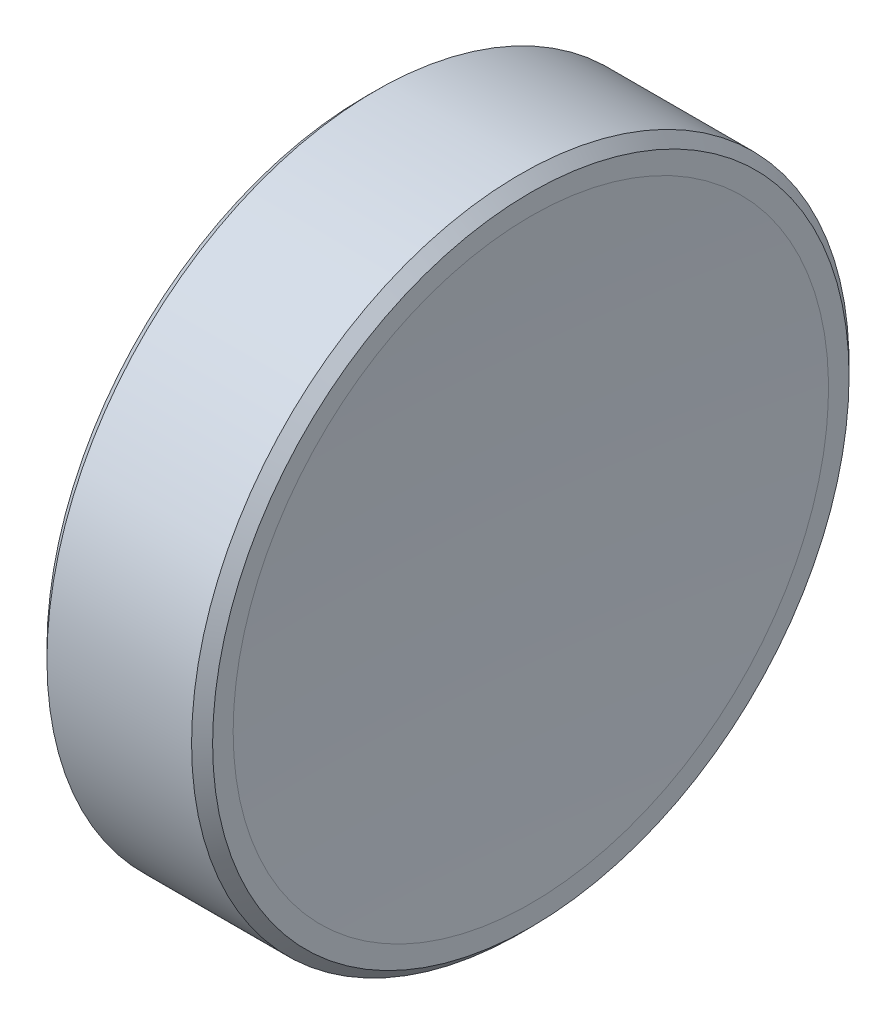
ISO-10303-21;
HEADER;
FILE_DESCRIPTION(('STEP AP214'),'2;1');
FILE_NAME('part.step','',(''),(''),'','','');
FILE_SCHEMA(('AUTOMOTIVE_DESIGN { 1 0 10303 214 1 1 1 1 }'));
ENDSEC;
DATA;
#1=APPLICATION_CONTEXT('core data for automotive mechanical design processes');
#2=APPLICATION_PROTOCOL_DEFINITION('international standard','automotive_design',2000,#1);
#3=PRODUCT_CONTEXT('',#1,'mechanical');
#4=PRODUCT('Part','Part','',(#3));
#5=PRODUCT_RELATED_PRODUCT_CATEGORY('part','',(#4));
#6=PRODUCT_DEFINITION_FORMATION('','',#4);
#7=PRODUCT_DEFINITION_CONTEXT('part definition',#1,'design');
#8=PRODUCT_DEFINITION('design','',#6,#7);
#9=PRODUCT_DEFINITION_SHAPE('','',#8);
#10=(LENGTH_UNIT() NAMED_UNIT(*) SI_UNIT(.MILLI.,.METRE.));
#11=(NAMED_UNIT(*) PLANE_ANGLE_UNIT() SI_UNIT($,.RADIAN.));
#12=(NAMED_UNIT(*) SI_UNIT($,.STERADIAN.) SOLID_ANGLE_UNIT());
#13=UNCERTAINTY_MEASURE_WITH_UNIT(LENGTH_MEASURE(1.E-05),#10,'distance_accuracy_value','');
#14=(GEOMETRIC_REPRESENTATION_CONTEXT(3) GLOBAL_UNCERTAINTY_ASSIGNED_CONTEXT((#13)) GLOBAL_UNIT_ASSIGNED_CONTEXT((#10,
#11,#12)) REPRESENTATION_CONTEXT('',''));
#15=CARTESIAN_POINT('',(0.,0.,0.));
#16=DIRECTION('',(0.,0.,1.));
#17=DIRECTION('',(1.,0.,0.));
#18=AXIS2_PLACEMENT_3D('',#15,#16,#17);
#19=CARTESIAN_POINT('',(267.602310034021,0.,0.));
#20=DIRECTION('',(-1.,0.,0.));
#21=DIRECTION('',(0.,1.,0.));
#22=AXIS2_PLACEMENT_3D('',#19,#20,#21);
#23=SPHERICAL_SURFACE('',#22,260.);
#24=CARTESIAN_POINT('',(8.,0.,0.));
#25=DIRECTION('',(-1.,0.,0.));
#26=DIRECTION('',(0.,0.,1.));
#27=AXIS2_PLACEMENT_3D('',#24,#25,#26);
#28=CIRCLE('',#27,14.375);
#29=CARTESIAN_POINT('',(8.,0.,14.375));
#30=VERTEX_POINT('',#29);
#31=EDGE_CURVE('E36',#30,#30,#28,.T.);
#32=ORIENTED_EDGE('',*,*,#31,.F.);
#33=EDGE_LOOP('',(#32));
#34=FACE_BOUND('',#33,.T.);
#35=ADVANCED_FACE('F15',(#34),#23,.F.);
#36=CARTESIAN_POINT('',(8.,15.875,0.));
#37=DIRECTION('',(-1.,0.,0.));
#38=DIRECTION('',(0.,0.,1.));
#39=AXIS2_PLACEMENT_3D('',#36,#37,#38);
#40=PLANE('',#39);
#41=CARTESIAN_POINT('',(8.,0.,0.));
#42=DIRECTION('',(-1.,0.,0.));
#43=DIRECTION('',(0.,0.,1.));
#44=AXIS2_PLACEMENT_3D('',#41,#42,#43);
#45=CIRCLE('',#44,15.367);
#46=CARTESIAN_POINT('',(8.,0.,15.367));
#47=VERTEX_POINT('',#46);
#48=EDGE_CURVE('E23',#47,#47,#45,.F.);
#49=ORIENTED_EDGE('',*,*,#48,.T.);
#50=EDGE_LOOP('',(#49));
#51=FACE_BOUND('',#50,.T.);
#52=ORIENTED_EDGE('',*,*,#31,.T.);
#53=EDGE_LOOP('',(#52));
#54=FACE_BOUND('',#53,.T.);
#55=ADVANCED_FACE('F40',(#51,#54),#40,.F.);
#56=CARTESIAN_POINT('',(0.,0.,0.));
#57=DIRECTION('',(-1.,0.,0.));
#58=DIRECTION('',(0.,0.,1.));
#59=AXIS2_PLACEMENT_3D('',#56,#57,#58);
#60=CYLINDRICAL_SURFACE('',#59,15.875);
#61=CARTESIAN_POINT('',(7.492,0.,0.));
#62=DIRECTION('',(-1.,0.,0.));
#63=DIRECTION('',(0.,0.,1.));
#64=AXIS2_PLACEMENT_3D('',#61,#62,#63);
#65=CIRCLE('',#64,15.875);
#66=CARTESIAN_POINT('',(7.492,0.,15.875));
#67=VERTEX_POINT('',#66);
#68=EDGE_CURVE('E27',#67,#67,#65,.T.);
#69=ORIENTED_EDGE('',*,*,#68,.T.);
#70=EDGE_LOOP('',(#69));
#71=FACE_BOUND('',#70,.T.);
#72=CARTESIAN_POINT('',(0.508000000000015,0.,0.));
#73=DIRECTION('',(1.,0.,0.));
#74=DIRECTION('',(0.,0.,-1.));
#75=AXIS2_PLACEMENT_3D('',#72,#73,#74);
#76=CIRCLE('',#75,15.875);
#77=CARTESIAN_POINT('',(0.508000000000015,0.,-15.875));
#78=VERTEX_POINT('',#77);
#79=EDGE_CURVE('E31',#78,#78,#76,.T.);
#80=ORIENTED_EDGE('',*,*,#79,.T.);
#81=EDGE_LOOP('',(#80));
#82=FACE_BOUND('',#81,.T.);
#83=ADVANCED_FACE('F49',(#71,#82),#60,.T.);
#84=CARTESIAN_POINT('',(0.,0.,0.));
#85=DIRECTION('',(1.,0.,0.));
#86=DIRECTION('',(0.,0.,-1.));
#87=AXIS2_PLACEMENT_3D('',#84,#85,#86);
#88=PLANE('',#87);
#89=CARTESIAN_POINT('',(0.,0.,0.));
#90=DIRECTION('',(1.,0.,0.));
#91=DIRECTION('',(0.,0.,-1.));
#92=AXIS2_PLACEMENT_3D('',#89,#90,#91);
#93=CIRCLE('',#92,15.367);
#94=CARTESIAN_POINT('',(0.,0.,-15.367));
#95=VERTEX_POINT('',#94);
#96=EDGE_CURVE('E10',#95,#95,#93,.F.);
#97=ORIENTED_EDGE('',*,*,#96,.T.);
#98=EDGE_LOOP('',(#97));
#99=FACE_BOUND('',#98,.T.);
#100=ADVANCED_FACE('F58',(#99),#88,.F.);
#101=CARTESIAN_POINT('',(7.492,0.,0.));
#102=DIRECTION('',(-1.,0.,0.));
#103=DIRECTION('',(0.,0.,1.));
#104=AXIS2_PLACEMENT_3D('',#101,#102,#103);
#105=CONICAL_SURFACE('',#104,15.875,0.785398163397452);
#106=ORIENTED_EDGE('',*,*,#48,.F.);
#107=EDGE_LOOP('',(#106));
#108=FACE_BOUND('',#107,.T.);
#109=ORIENTED_EDGE('',*,*,#68,.F.);
#110=EDGE_LOOP('',(#109));
#111=FACE_BOUND('',#110,.T.);
#112=ADVANCED_FACE('F53',(#108,#111),#105,.T.);
#113=CARTESIAN_POINT('',(0.,0.,0.));
#114=DIRECTION('',(1.,0.,0.));
#115=DIRECTION('',(0.,0.,-1.));
#116=AXIS2_PLACEMENT_3D('',#113,#114,#115);
#117=CONICAL_SURFACE('',#116,15.367,0.785398163397442);
#118=ORIENTED_EDGE('',*,*,#79,.F.);
#119=EDGE_LOOP('',(#118));
#120=FACE_BOUND('',#119,.T.);
#121=ORIENTED_EDGE('',*,*,#96,.F.);
#122=EDGE_LOOP('',(#121));
#123=FACE_BOUND('',#122,.T.);
#124=ADVANCED_FACE('F18',(#120,#123),#117,.T.);
#125=CLOSED_SHELL('',(#35,#55,#83,#100,#112,#124));
#126=MANIFOLD_SOLID_BREP('B1',#125);
#127=ADVANCED_BREP_SHAPE_REPRESENTATION('',(#18,#126),#14);
#128=SHAPE_DEFINITION_REPRESENTATION(#9,#127);
ENDSEC;
END-ISO-10303-21;
